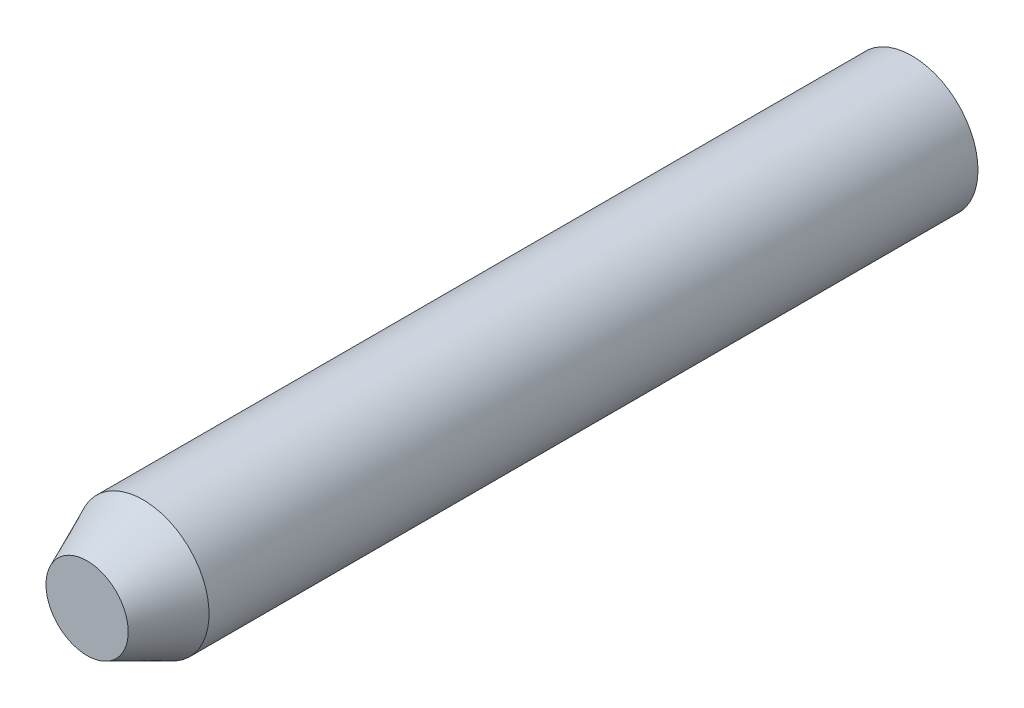
ISO-10303-21;
HEADER;
FILE_DESCRIPTION(('STEP AP214'),'2;1');
FILE_NAME('part.step','',(''),(''),'','','');
FILE_SCHEMA(('AUTOMOTIVE_DESIGN { 1 0 10303 214 1 1 1 1 }'));
ENDSEC;
DATA;
#1=APPLICATION_CONTEXT('core data for automotive mechanical design processes');
#2=APPLICATION_PROTOCOL_DEFINITION('international standard','automotive_design',2000,#1);
#3=PRODUCT_CONTEXT('',#1,'mechanical');
#4=PRODUCT('Part','Part','',(#3));
#5=PRODUCT_RELATED_PRODUCT_CATEGORY('part','',(#4));
#6=PRODUCT_DEFINITION_FORMATION('','',#4);
#7=PRODUCT_DEFINITION_CONTEXT('part definition',#1,'design');
#8=PRODUCT_DEFINITION('design','',#6,#7);
#9=PRODUCT_DEFINITION_SHAPE('','',#8);
#10=(LENGTH_UNIT() NAMED_UNIT(*) SI_UNIT(.MILLI.,.METRE.));
#11=(NAMED_UNIT(*) PLANE_ANGLE_UNIT() SI_UNIT($,.RADIAN.));
#12=(NAMED_UNIT(*) SI_UNIT($,.STERADIAN.) SOLID_ANGLE_UNIT());
#13=UNCERTAINTY_MEASURE_WITH_UNIT(LENGTH_MEASURE(1.E-05),#10,'distance_accuracy_value','');
#14=(GEOMETRIC_REPRESENTATION_CONTEXT(3) GLOBAL_UNCERTAINTY_ASSIGNED_CONTEXT((#13)) GLOBAL_UNIT_ASSIGNED_CONTEXT((#10,
#11,#12)) REPRESENTATION_CONTEXT('',''));
#15=CARTESIAN_POINT('',(0.,0.,0.));
#16=DIRECTION('',(0.,0.,1.));
#17=DIRECTION('',(1.,0.,0.));
#18=AXIS2_PLACEMENT_3D('',#15,#16,#17);
#19=CARTESIAN_POINT('',(0.,0.,100.));
#20=DIRECTION('',(0.,0.,-1.));
#21=DIRECTION('',(-1.,0.,0.));
#22=AXIS2_PLACEMENT_3D('',#19,#20,#21);
#23=CYLINDRICAL_SURFACE('',#22,8.);
#24=CARTESIAN_POINT('',(0.,0.,93.2143505959903));
#25=DIRECTION('',(0.,0.,-1.));
#26=DIRECTION('',(-1.,0.,0.));
#27=AXIS2_PLACEMENT_3D('',#24,#25,#26);
#28=CIRCLE('',#27,8.);
#29=CARTESIAN_POINT('',(-8.,0.,93.2143505959903));
#30=VERTEX_POINT('',#29);
#31=EDGE_CURVE('E37',#30,#30,#28,.T.);
#32=ORIENTED_EDGE('',*,*,#31,.T.);
#33=EDGE_LOOP('',(#32));
#34=FACE_BOUND('',#33,.T.);
#35=CARTESIAN_POINT('',(0.,0.,0.));
#36=DIRECTION('',(0.,0.,1.));
#37=DIRECTION('',(1.,0.,0.));
#38=AXIS2_PLACEMENT_3D('',#35,#36,#37);
#39=CIRCLE('',#38,8.);
#40=CARTESIAN_POINT('',(8.,0.,0.));
#41=VERTEX_POINT('',#40);
#42=EDGE_CURVE('E10',#41,#41,#39,.T.);
#43=ORIENTED_EDGE('',*,*,#42,.T.);
#44=EDGE_LOOP('',(#43));
#45=FACE_BOUND('',#44,.T.);
#46=ADVANCED_FACE('F31',(#34,#45),#23,.T.);
#47=CARTESIAN_POINT('',(0.,0.,0.));
#48=DIRECTION('',(0.,0.,1.));
#49=DIRECTION('',(1.,0.,0.));
#50=AXIS2_PLACEMENT_3D('',#47,#48,#49);
#51=PLANE('',#50);
#52=ORIENTED_EDGE('',*,*,#42,.F.);
#53=EDGE_LOOP('',(#52));
#54=FACE_BOUND('',#53,.T.);
#55=ADVANCED_FACE('F56',(#54),#51,.F.);
#56=CARTESIAN_POINT('',(0.,0.,100.));
#57=DIRECTION('',(0.,0.,-1.));
#58=DIRECTION('',(-1.,0.,0.));
#59=AXIS2_PLACEMENT_3D('',#56,#57,#58);
#60=CONICAL_SURFACE('',#59,4.98308031802824,0.418356674630854);
#61=ORIENTED_EDGE('',*,*,#31,.F.);
#62=EDGE_LOOP('',(#61));
#63=FACE_BOUND('',#62,.T.);
#64=CARTESIAN_POINT('',(0.,0.,100.));
#65=DIRECTION('',(0.,0.,-1.));
#66=DIRECTION('',(-1.,0.,0.));
#67=AXIS2_PLACEMENT_3D('',#64,#65,#66);
#68=CIRCLE('',#67,4.98308031802824);
#69=CARTESIAN_POINT('',(-4.98308031802824,0.,100.));
#70=VERTEX_POINT('',#69);
#71=EDGE_CURVE('E41',#70,#70,#68,.T.);
#72=ORIENTED_EDGE('',*,*,#71,.T.);
#73=EDGE_LOOP('',(#72));
#74=FACE_BOUND('',#73,.T.);
#75=ADVANCED_FACE('F48',(#63,#74),#60,.T.);
#76=CARTESIAN_POINT('',(0.,0.,100.));
#77=DIRECTION('',(0.,0.,1.));
#78=DIRECTION('',(1.,0.,0.));
#79=AXIS2_PLACEMENT_3D('',#76,#77,#78);
#80=PLANE('',#79);
#81=ORIENTED_EDGE('',*,*,#71,.F.);
#82=EDGE_LOOP('',(#81));
#83=FACE_BOUND('',#82,.T.);
#84=ADVANCED_FACE('F50',(#83),#80,.T.);
#85=CLOSED_SHELL('',(#46,#55,#75,#84));
#86=MANIFOLD_SOLID_BREP('B2',#85);
#87=ADVANCED_BREP_SHAPE_REPRESENTATION('',(#18,#86),#14);
#88=SHAPE_DEFINITION_REPRESENTATION(#9,#87);
ENDSEC;
END-ISO-10303-21;
